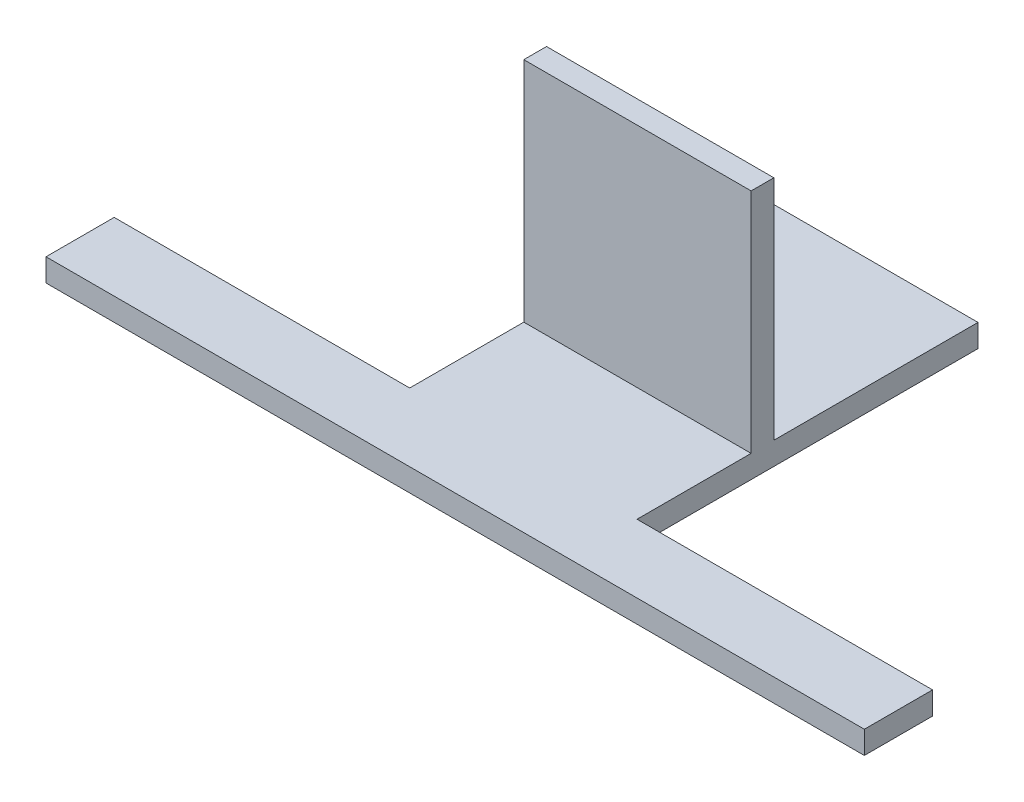
ISO-10303-21;
HEADER;
FILE_DESCRIPTION(('STEP AP214'),'2;1');
FILE_NAME('part.step','',(''),(''),'','','');
FILE_SCHEMA(('AUTOMOTIVE_DESIGN { 1 0 10303 214 1 1 1 1 }'));
ENDSEC;
DATA;
#1=APPLICATION_CONTEXT('core data for automotive mechanical design processes');
#2=APPLICATION_PROTOCOL_DEFINITION('international standard','automotive_design',2000,#1);
#3=PRODUCT_CONTEXT('',#1,'mechanical');
#4=PRODUCT('Part','Part','',(#3));
#5=PRODUCT_RELATED_PRODUCT_CATEGORY('part','',(#4));
#6=PRODUCT_DEFINITION_FORMATION('','',#4);
#7=PRODUCT_DEFINITION_CONTEXT('part definition',#1,'design');
#8=PRODUCT_DEFINITION('design','',#6,#7);
#9=PRODUCT_DEFINITION_SHAPE('','',#8);
#10=(LENGTH_UNIT() NAMED_UNIT(*) SI_UNIT(.MILLI.,.METRE.));
#11=(NAMED_UNIT(*) PLANE_ANGLE_UNIT() SI_UNIT($,.RADIAN.));
#12=(NAMED_UNIT(*) SI_UNIT($,.STERADIAN.) SOLID_ANGLE_UNIT());
#13=UNCERTAINTY_MEASURE_WITH_UNIT(LENGTH_MEASURE(1.E-05),#10,'distance_accuracy_value','');
#14=(GEOMETRIC_REPRESENTATION_CONTEXT(3) GLOBAL_UNCERTAINTY_ASSIGNED_CONTEXT((#13)) GLOBAL_UNIT_ASSIGNED_CONTEXT((#10,
#11,#12)) REPRESENTATION_CONTEXT('',''));
#15=CARTESIAN_POINT('',(0.,0.,0.));
#16=DIRECTION('',(0.,0.,1.));
#17=DIRECTION('',(1.,0.,0.));
#18=AXIS2_PLACEMENT_3D('',#15,#16,#17);
#19=CARTESIAN_POINT('',(0.,10.,0.));
#20=DIRECTION('',(0.,-1.,0.));
#21=DIRECTION('',(0.,0.,-1.));
#22=AXIS2_PLACEMENT_3D('',#19,#20,#21);
#23=PLANE('',#22);
#24=DIRECTION('',(-1.,0.,0.));
#25=VECTOR('',#24,1.);
#26=CARTESIAN_POINT('',(130.,10.,-90.1927969945846));
#27=LINE('',#26,#25);
#28=CARTESIAN_POINT('',(230.,10.,-90.1927969945846));
#29=VERTEX_POINT('',#28);
#30=CARTESIAN_POINT('',(130.,10.,-90.1927969945846));
#31=VERTEX_POINT('',#30);
#32=EDGE_CURVE('E146',#29,#31,#27,.T.);
#33=ORIENTED_EDGE('',*,*,#32,.F.);
#34=DIRECTION('',(0.,0.,1.));
#35=VECTOR('',#34,1.);
#36=CARTESIAN_POINT('',(230.,10.,-180.));
#37=LINE('',#36,#35);
#38=CARTESIAN_POINT('',(230.,10.,-180.));
#39=VERTEX_POINT('',#38);
#40=EDGE_CURVE('E190',#39,#29,#37,.T.);
#41=ORIENTED_EDGE('',*,*,#40,.F.);
#42=DIRECTION('',(1.,0.,0.));
#43=VECTOR('',#42,1.);
#44=CARTESIAN_POINT('',(230.,10.,-180.));
#45=LINE('',#44,#43);
#46=CARTESIAN_POINT('',(130.,10.,-180.));
#47=VERTEX_POINT('',#46);
#48=EDGE_CURVE('E179',#47,#39,#45,.T.);
#49=ORIENTED_EDGE('',*,*,#48,.F.);
#50=DIRECTION('',(0.,0.,1.));
#51=VECTOR('',#50,1.);
#52=CARTESIAN_POINT('',(130.,10.,-180.));
#53=LINE('',#52,#51);
#54=EDGE_CURVE('E60',#47,#31,#53,.T.);
#55=ORIENTED_EDGE('',*,*,#54,.T.);
#56=EDGE_LOOP('',(#33,#41,#49,#55));
#57=FACE_BOUND('',#56,.T.);
#58=ADVANCED_FACE('F35',(#57),#23,.F.);
#59=DIRECTION('',(1.,0.,0.));
#60=VECTOR('',#59,1.);
#61=CARTESIAN_POINT('',(130.,10.,-80.1927969945846));
#62=LINE('',#61,#60);
#63=CARTESIAN_POINT('',(130.,10.,-80.1927969945846));
#64=VERTEX_POINT('',#63);
#65=CARTESIAN_POINT('',(230.,10.,-80.1927969945846));
#66=VERTEX_POINT('',#65);
#67=EDGE_CURVE('E52',#64,#66,#62,.T.);
#68=ORIENTED_EDGE('',*,*,#67,.F.);
#69=CARTESIAN_POINT('',(130.,10.,-30.));
#70=VERTEX_POINT('',#69);
#71=EDGE_CURVE('E150',#64,#70,#53,.T.);
#72=ORIENTED_EDGE('',*,*,#71,.T.);
#73=DIRECTION('',(-1.,0.,0.));
#74=VECTOR('',#73,1.);
#75=CARTESIAN_POINT('',(0.,10.,-30.));
#76=LINE('',#75,#74);
#77=CARTESIAN_POINT('',(0.,10.,-30.));
#78=VERTEX_POINT('',#77);
#79=EDGE_CURVE('E250',#70,#78,#76,.T.);
#80=ORIENTED_EDGE('',*,*,#79,.T.);
#81=DIRECTION('',(0.,0.,1.));
#82=VECTOR('',#81,1.);
#83=CARTESIAN_POINT('',(0.,10.,0.));
#84=LINE('',#83,#82);
#85=CARTESIAN_POINT('',(0.,10.,0.));
#86=VERTEX_POINT('',#85);
#87=EDGE_CURVE('E238',#78,#86,#84,.T.);
#88=ORIENTED_EDGE('',*,*,#87,.T.);
#89=DIRECTION('',(1.,0.,0.));
#90=VECTOR('',#89,1.);
#91=CARTESIAN_POINT('',(0.,10.,0.));
#92=LINE('',#91,#90);
#93=CARTESIAN_POINT('',(360.,10.,0.));
#94=VERTEX_POINT('',#93);
#95=EDGE_CURVE('E264',#86,#94,#92,.T.);
#96=ORIENTED_EDGE('',*,*,#95,.T.);
#97=DIRECTION('',(0.,0.,-1.));
#98=VECTOR('',#97,1.);
#99=CARTESIAN_POINT('',(360.,10.,0.));
#100=LINE('',#99,#98);
#101=CARTESIAN_POINT('',(360.,10.,-30.));
#102=VERTEX_POINT('',#101);
#103=EDGE_CURVE('E251',#94,#102,#100,.T.);
#104=ORIENTED_EDGE('',*,*,#103,.T.);
#105=CARTESIAN_POINT('',(230.,10.,-30.));
#106=VERTEX_POINT('',#105);
#107=EDGE_CURVE('E246',#102,#106,#76,.T.);
#108=ORIENTED_EDGE('',*,*,#107,.T.);
#109=EDGE_CURVE('E181',#66,#106,#37,.T.);
#110=ORIENTED_EDGE('',*,*,#109,.F.);
#111=EDGE_LOOP('',(#68,#72,#80,#88,#96,#104,#108,#110));
#112=FACE_BOUND('',#111,.T.);
#113=ADVANCED_FACE('F268',(#112),#23,.F.);
#114=CARTESIAN_POINT('',(0.,10.,-30.));
#115=DIRECTION('',(0.,0.,1.));
#116=DIRECTION('',(1.,0.,0.));
#117=AXIS2_PLACEMENT_3D('',#114,#115,#116);
#118=PLANE('',#117);
#119=DIRECTION('',(0.,-1.,0.));
#120=VECTOR('',#119,1.);
#121=CARTESIAN_POINT('',(230.,10.,-30.));
#122=LINE('',#121,#120);
#123=CARTESIAN_POINT('',(230.,0.,-30.));
#124=VERTEX_POINT('',#123);
#125=EDGE_CURVE('E151',#106,#124,#122,.T.);
#126=ORIENTED_EDGE('',*,*,#125,.F.);
#127=ORIENTED_EDGE('',*,*,#107,.F.);
#128=DIRECTION('',(0.,-1.,0.));
#129=VECTOR('',#128,1.);
#130=CARTESIAN_POINT('',(360.,10.,-30.));
#131=LINE('',#130,#129);
#132=CARTESIAN_POINT('',(360.,0.,-30.));
#133=VERTEX_POINT('',#132);
#134=EDGE_CURVE('E241',#102,#133,#131,.T.);
#135=ORIENTED_EDGE('',*,*,#134,.T.);
#136=DIRECTION('',(-1.,0.,0.));
#137=VECTOR('',#136,1.);
#138=CARTESIAN_POINT('',(0.,0.,-30.));
#139=LINE('',#138,#137);
#140=EDGE_CURVE('E237',#133,#124,#139,.T.);
#141=ORIENTED_EDGE('',*,*,#140,.T.);
#142=EDGE_LOOP('',(#126,#127,#135,#141));
#143=FACE_BOUND('',#142,.T.);
#144=ADVANCED_FACE('F272',(#143),#118,.F.);
#145=DIRECTION('',(0.,1.,0.));
#146=VECTOR('',#145,1.);
#147=CARTESIAN_POINT('',(130.,10.,-30.));
#148=LINE('',#147,#146);
#149=CARTESIAN_POINT('',(130.,0.,-30.));
#150=VERTEX_POINT('',#149);
#151=EDGE_CURVE('E154',#150,#70,#148,.T.);
#152=ORIENTED_EDGE('',*,*,#151,.F.);
#153=CARTESIAN_POINT('',(0.,0.,-30.));
#154=VERTEX_POINT('',#153);
#155=EDGE_CURVE('E228',#150,#154,#139,.T.);
#156=ORIENTED_EDGE('',*,*,#155,.T.);
#157=DIRECTION('',(0.,-1.,0.));
#158=VECTOR('',#157,1.);
#159=CARTESIAN_POINT('',(0.,10.,-30.));
#160=LINE('',#159,#158);
#161=EDGE_CURVE('E231',#78,#154,#160,.T.);
#162=ORIENTED_EDGE('',*,*,#161,.F.);
#163=ORIENTED_EDGE('',*,*,#79,.F.);
#164=EDGE_LOOP('',(#152,#156,#162,#163));
#165=FACE_BOUND('',#164,.T.);
#166=ADVANCED_FACE('F258',(#165),#118,.F.);
#167=CARTESIAN_POINT('',(0.,10.,0.));
#168=DIRECTION('',(1.,0.,0.));
#169=DIRECTION('',(0.,0.,-1.));
#170=AXIS2_PLACEMENT_3D('',#167,#168,#169);
#171=PLANE('',#170);
#172=DIRECTION('',(0.,0.,1.));
#173=VECTOR('',#172,1.);
#174=CARTESIAN_POINT('',(0.,0.,0.));
#175=LINE('',#174,#173);
#176=CARTESIAN_POINT('',(0.,0.,0.));
#177=VERTEX_POINT('',#176);
#178=EDGE_CURVE('E210',#154,#177,#175,.T.);
#179=ORIENTED_EDGE('',*,*,#178,.T.);
#180=DIRECTION('',(0.,-1.,0.));
#181=VECTOR('',#180,1.);
#182=CARTESIAN_POINT('',(0.,10.,0.));
#183=LINE('',#182,#181);
#184=EDGE_CURVE('E11',#86,#177,#183,.T.);
#185=ORIENTED_EDGE('',*,*,#184,.F.);
#186=ORIENTED_EDGE('',*,*,#87,.F.);
#187=ORIENTED_EDGE('',*,*,#161,.T.);
#188=EDGE_LOOP('',(#179,#185,#186,#187));
#189=FACE_BOUND('',#188,.T.);
#190=ADVANCED_FACE('F37',(#189),#171,.F.);
#191=CARTESIAN_POINT('',(0.,10.,0.));
#192=DIRECTION('',(0.,0.,-1.));
#193=DIRECTION('',(-1.,0.,0.));
#194=AXIS2_PLACEMENT_3D('',#191,#192,#193);
#195=PLANE('',#194);
#196=DIRECTION('',(1.,0.,0.));
#197=VECTOR('',#196,1.);
#198=CARTESIAN_POINT('',(0.,0.,0.));
#199=LINE('',#198,#197);
#200=CARTESIAN_POINT('',(360.,0.,0.));
#201=VERTEX_POINT('',#200);
#202=EDGE_CURVE('E215',#177,#201,#199,.T.);
#203=ORIENTED_EDGE('',*,*,#202,.T.);
#204=DIRECTION('',(0.,-1.,0.));
#205=VECTOR('',#204,1.);
#206=CARTESIAN_POINT('',(360.,10.,0.));
#207=LINE('',#206,#205);
#208=EDGE_CURVE('E44',#94,#201,#207,.T.);
#209=ORIENTED_EDGE('',*,*,#208,.F.);
#210=ORIENTED_EDGE('',*,*,#95,.F.);
#211=ORIENTED_EDGE('',*,*,#184,.T.);
#212=EDGE_LOOP('',(#203,#209,#210,#211));
#213=FACE_BOUND('',#212,.T.);
#214=ADVANCED_FACE('F263',(#213),#195,.F.);
#215=CARTESIAN_POINT('',(360.,10.,0.));
#216=DIRECTION('',(-1.,0.,0.));
#217=DIRECTION('',(0.,0.,1.));
#218=AXIS2_PLACEMENT_3D('',#215,#216,#217);
#219=PLANE('',#218);
#220=DIRECTION('',(0.,0.,-1.));
#221=VECTOR('',#220,1.);
#222=CARTESIAN_POINT('',(360.,0.,0.));
#223=LINE('',#222,#221);
#224=EDGE_CURVE('E221',#201,#133,#223,.T.);
#225=ORIENTED_EDGE('',*,*,#224,.T.);
#226=ORIENTED_EDGE('',*,*,#134,.F.);
#227=ORIENTED_EDGE('',*,*,#103,.F.);
#228=ORIENTED_EDGE('',*,*,#208,.T.);
#229=EDGE_LOOP('',(#225,#226,#227,#228));
#230=FACE_BOUND('',#229,.T.);
#231=ADVANCED_FACE('F270',(#230),#219,.F.);
#232=CARTESIAN_POINT('',(0.,0.,0.));
#233=DIRECTION('',(0.,-1.,0.));
#234=DIRECTION('',(0.,0.,-1.));
#235=AXIS2_PLACEMENT_3D('',#232,#233,#234);
#236=PLANE('',#235);
#237=ORIENTED_EDGE('',*,*,#178,.F.);
#238=ORIENTED_EDGE('',*,*,#155,.F.);
#239=DIRECTION('',(0.,0.,1.));
#240=VECTOR('',#239,1.);
#241=CARTESIAN_POINT('',(130.,0.,-180.));
#242=LINE('',#241,#240);
#243=CARTESIAN_POINT('',(130.,0.,-180.));
#244=VERTEX_POINT('',#243);
#245=EDGE_CURVE('E203',#244,#150,#242,.T.);
#246=ORIENTED_EDGE('',*,*,#245,.F.);
#247=DIRECTION('',(-1.,0.,0.));
#248=VECTOR('',#247,1.);
#249=CARTESIAN_POINT('',(230.,0.,-180.));
#250=LINE('',#249,#248);
#251=CARTESIAN_POINT('',(230.,0.,-180.));
#252=VERTEX_POINT('',#251);
#253=EDGE_CURVE('E175',#252,#244,#250,.T.);
#254=ORIENTED_EDGE('',*,*,#253,.F.);
#255=DIRECTION('',(0.,0.,1.));
#256=VECTOR('',#255,1.);
#257=CARTESIAN_POINT('',(230.,0.,-180.));
#258=LINE('',#257,#256);
#259=EDGE_CURVE('E207',#252,#124,#258,.T.);
#260=ORIENTED_EDGE('',*,*,#259,.T.);
#261=ORIENTED_EDGE('',*,*,#140,.F.);
#262=ORIENTED_EDGE('',*,*,#224,.F.);
#263=ORIENTED_EDGE('',*,*,#202,.F.);
#264=EDGE_LOOP('',(#237,#238,#246,#254,#260,#261,#262,#263));
#265=FACE_BOUND('',#264,.T.);
#266=ADVANCED_FACE('F259',(#265),#236,.T.);
#267=CARTESIAN_POINT('',(230.,10.,-180.));
#268=DIRECTION('',(-1.,0.,0.));
#269=DIRECTION('',(0.,0.,1.));
#270=AXIS2_PLACEMENT_3D('',#267,#268,#269);
#271=PLANE('',#270);
#272=ORIENTED_EDGE('',*,*,#125,.T.);
#273=ORIENTED_EDGE('',*,*,#259,.F.);
#274=DIRECTION('',(0.,-1.,0.));
#275=VECTOR('',#274,1.);
#276=CARTESIAN_POINT('',(230.,10.,-180.));
#277=LINE('',#276,#275);
#278=EDGE_CURVE('E172',#39,#252,#277,.T.);
#279=ORIENTED_EDGE('',*,*,#278,.F.);
#280=ORIENTED_EDGE('',*,*,#40,.T.);
#281=DIRECTION('',(0.,-1.,0.));
#282=VECTOR('',#281,1.);
#283=CARTESIAN_POINT('',(230.,110.,-90.1927969945846));
#284=LINE('',#283,#282);
#285=CARTESIAN_POINT('',(230.,110.,-90.1927969945846));
#286=VERTEX_POINT('',#285);
#287=EDGE_CURVE('E156',#286,#29,#284,.T.);
#288=ORIENTED_EDGE('',*,*,#287,.F.);
#289=DIRECTION('',(0.,0.,-1.));
#290=VECTOR('',#289,1.);
#291=CARTESIAN_POINT('',(230.,110.,-90.1927969945846));
#292=LINE('',#291,#290);
#293=CARTESIAN_POINT('',(230.,110.,-80.1927969945846));
#294=VERTEX_POINT('',#293);
#295=EDGE_CURVE('E136',#294,#286,#292,.T.);
#296=ORIENTED_EDGE('',*,*,#295,.F.);
#297=DIRECTION('',(0.,-1.,0.));
#298=VECTOR('',#297,1.);
#299=CARTESIAN_POINT('',(230.,110.,-80.1927969945846));
#300=LINE('',#299,#298);
#301=EDGE_CURVE('E133',#294,#66,#300,.T.);
#302=ORIENTED_EDGE('',*,*,#301,.T.);
#303=ORIENTED_EDGE('',*,*,#109,.T.);
#304=EDGE_LOOP('',(#272,#273,#279,#280,#288,#296,#302,#303));
#305=FACE_BOUND('',#304,.T.);
#306=ADVANCED_FACE('F274',(#305),#271,.F.);
#307=CARTESIAN_POINT('',(130.,10.,-180.));
#308=DIRECTION('',(1.,0.,0.));
#309=DIRECTION('',(0.,0.,-1.));
#310=AXIS2_PLACEMENT_3D('',#307,#308,#309);
#311=PLANE('',#310);
#312=ORIENTED_EDGE('',*,*,#151,.T.);
#313=ORIENTED_EDGE('',*,*,#71,.F.);
#314=DIRECTION('',(0.,-1.,0.));
#315=VECTOR('',#314,1.);
#316=CARTESIAN_POINT('',(130.,110.,-80.1927969945846));
#317=LINE('',#316,#315);
#318=CARTESIAN_POINT('',(130.,110.,-80.1927969945846));
#319=VERTEX_POINT('',#318);
#320=EDGE_CURVE('E131',#319,#64,#317,.T.);
#321=ORIENTED_EDGE('',*,*,#320,.F.);
#322=DIRECTION('',(0.,0.,1.));
#323=VECTOR('',#322,1.);
#324=CARTESIAN_POINT('',(130.,110.,-90.1927969945846));
#325=LINE('',#324,#323);
#326=CARTESIAN_POINT('',(130.,110.,-90.1927969945846));
#327=VERTEX_POINT('',#326);
#328=EDGE_CURVE('E137',#327,#319,#325,.T.);
#329=ORIENTED_EDGE('',*,*,#328,.F.);
#330=DIRECTION('',(0.,-1.,0.));
#331=VECTOR('',#330,1.);
#332=CARTESIAN_POINT('',(130.,110.,-90.1927969945846));
#333=LINE('',#332,#331);
#334=EDGE_CURVE('E165',#327,#31,#333,.T.);
#335=ORIENTED_EDGE('',*,*,#334,.T.);
#336=ORIENTED_EDGE('',*,*,#54,.F.);
#337=DIRECTION('',(0.,1.,0.));
#338=VECTOR('',#337,1.);
#339=CARTESIAN_POINT('',(130.,10.,-180.));
#340=LINE('',#339,#338);
#341=EDGE_CURVE('E177',#244,#47,#340,.T.);
#342=ORIENTED_EDGE('',*,*,#341,.F.);
#343=ORIENTED_EDGE('',*,*,#245,.T.);
#344=EDGE_LOOP('',(#312,#313,#321,#329,#335,#336,#342,#343));
#345=FACE_BOUND('',#344,.T.);
#346=ADVANCED_FACE('F149',(#345),#311,.F.);
#347=CARTESIAN_POINT('',(0.,0.,-180.));
#348=DIRECTION('',(0.,0.,-1.));
#349=DIRECTION('',(-1.,0.,0.));
#350=AXIS2_PLACEMENT_3D('',#347,#348,#349);
#351=PLANE('',#350);
#352=ORIENTED_EDGE('',*,*,#278,.T.);
#353=ORIENTED_EDGE('',*,*,#253,.T.);
#354=ORIENTED_EDGE('',*,*,#341,.T.);
#355=ORIENTED_EDGE('',*,*,#48,.T.);
#356=EDGE_LOOP('',(#352,#353,#354,#355));
#357=FACE_BOUND('',#356,.T.);
#358=ADVANCED_FACE('F284',(#357),#351,.T.);
#359=CARTESIAN_POINT('',(130.,110.,-80.1927969945846));
#360=DIRECTION('',(0.,0.,-1.));
#361=DIRECTION('',(-1.,0.,0.));
#362=AXIS2_PLACEMENT_3D('',#359,#360,#361);
#363=PLANE('',#362);
#364=ORIENTED_EDGE('',*,*,#67,.T.);
#365=ORIENTED_EDGE('',*,*,#301,.F.);
#366=DIRECTION('',(1.,0.,0.));
#367=VECTOR('',#366,1.);
#368=CARTESIAN_POINT('',(130.,110.,-80.1927969945846));
#369=LINE('',#368,#367);
#370=EDGE_CURVE('E127',#319,#294,#369,.T.);
#371=ORIENTED_EDGE('',*,*,#370,.F.);
#372=ORIENTED_EDGE('',*,*,#320,.T.);
#373=EDGE_LOOP('',(#364,#365,#371,#372));
#374=FACE_BOUND('',#373,.T.);
#375=ADVANCED_FACE('F129',(#374),#363,.F.);
#376=CARTESIAN_POINT('',(130.,110.,-90.1927969945846));
#377=DIRECTION('',(0.,0.,1.));
#378=DIRECTION('',(1.,0.,0.));
#379=AXIS2_PLACEMENT_3D('',#376,#377,#378);
#380=PLANE('',#379);
#381=ORIENTED_EDGE('',*,*,#32,.T.);
#382=ORIENTED_EDGE('',*,*,#334,.F.);
#383=DIRECTION('',(-1.,0.,0.));
#384=VECTOR('',#383,1.);
#385=CARTESIAN_POINT('',(130.,110.,-90.1927969945846));
#386=LINE('',#385,#384);
#387=EDGE_CURVE('E142',#286,#327,#386,.T.);
#388=ORIENTED_EDGE('',*,*,#387,.F.);
#389=ORIENTED_EDGE('',*,*,#287,.T.);
#390=EDGE_LOOP('',(#381,#382,#388,#389));
#391=FACE_BOUND('',#390,.T.);
#392=ADVANCED_FACE('F281',(#391),#380,.F.);
#393=CARTESIAN_POINT('',(0.,110.,0.));
#394=DIRECTION('',(0.,1.,0.));
#395=DIRECTION('',(0.,0.,1.));
#396=AXIS2_PLACEMENT_3D('',#393,#394,#395);
#397=PLANE('',#396);
#398=ORIENTED_EDGE('',*,*,#328,.T.);
#399=ORIENTED_EDGE('',*,*,#370,.T.);
#400=ORIENTED_EDGE('',*,*,#295,.T.);
#401=ORIENTED_EDGE('',*,*,#387,.T.);
#402=EDGE_LOOP('',(#398,#399,#400,#401));
#403=FACE_BOUND('',#402,.T.);
#404=ADVANCED_FACE('F140',(#403),#397,.T.);
#405=CLOSED_SHELL('',(#58,#113,#144,#166,#190,#214,#231,#266,#306,#346,#358,#375,#392,#404));
#406=MANIFOLD_SOLID_BREP('B2',#405);
#407=ADVANCED_BREP_SHAPE_REPRESENTATION('',(#18,#406),#14);
#408=SHAPE_DEFINITION_REPRESENTATION(#9,#407);
ENDSEC;
END-ISO-10303-21;
